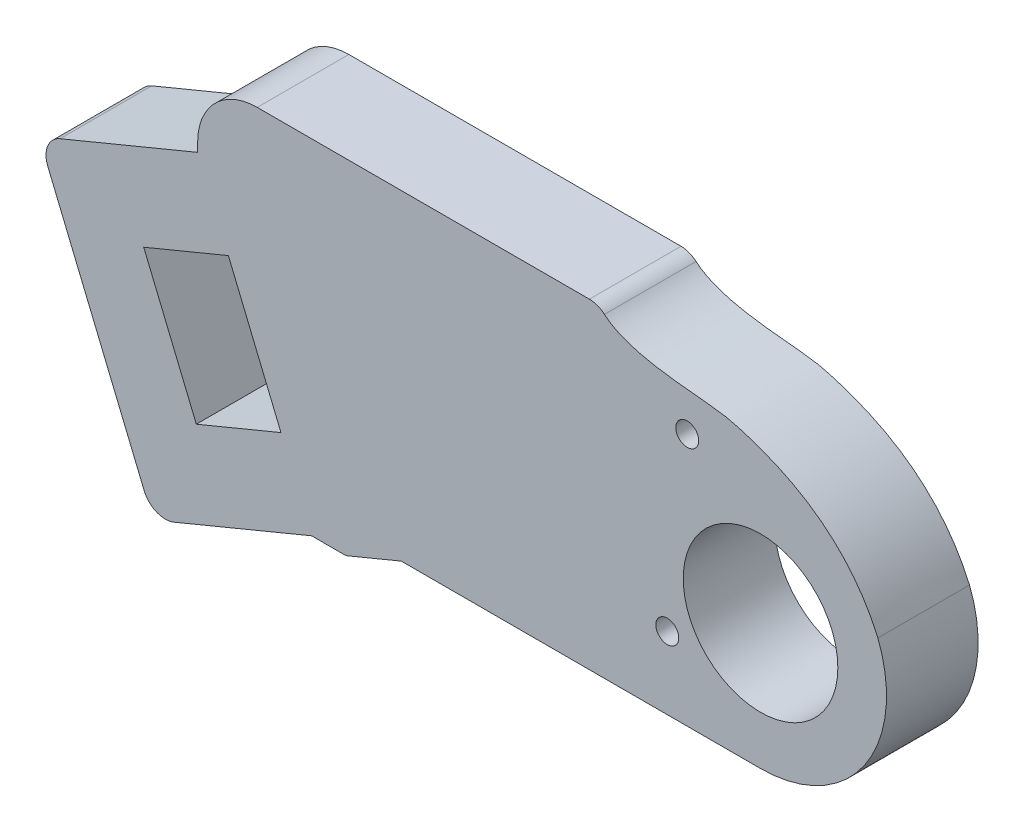
ISO-10303-21;
HEADER;
FILE_DESCRIPTION(('STEP AP214'),'2;1');
FILE_NAME('part.step','',(''),(''),'','','');
FILE_SCHEMA(('AUTOMOTIVE_DESIGN { 1 0 10303 214 1 1 1 1 }'));
ENDSEC;
DATA;
#1=APPLICATION_CONTEXT('core data for automotive mechanical design processes');
#2=APPLICATION_PROTOCOL_DEFINITION('international standard','automotive_design',2000,#1);
#3=PRODUCT_CONTEXT('',#1,'mechanical');
#4=PRODUCT('Part','Part','',(#3));
#5=PRODUCT_RELATED_PRODUCT_CATEGORY('part','',(#4));
#6=PRODUCT_DEFINITION_FORMATION('','',#4);
#7=PRODUCT_DEFINITION_CONTEXT('part definition',#1,'design');
#8=PRODUCT_DEFINITION('design','',#6,#7);
#9=PRODUCT_DEFINITION_SHAPE('','',#8);
#10=(LENGTH_UNIT() NAMED_UNIT(*) SI_UNIT(.MILLI.,.METRE.));
#11=(NAMED_UNIT(*) PLANE_ANGLE_UNIT() SI_UNIT($,.RADIAN.));
#12=(NAMED_UNIT(*) SI_UNIT($,.STERADIAN.) SOLID_ANGLE_UNIT());
#13=UNCERTAINTY_MEASURE_WITH_UNIT(LENGTH_MEASURE(1.E-05),#10,'distance_accuracy_value','');
#14=(GEOMETRIC_REPRESENTATION_CONTEXT(3) GLOBAL_UNCERTAINTY_ASSIGNED_CONTEXT((#13)) GLOBAL_UNIT_ASSIGNED_CONTEXT((#10,
#11,#12)) REPRESENTATION_CONTEXT('',''));
#15=CARTESIAN_POINT('',(0.,0.,0.));
#16=DIRECTION('',(0.,0.,1.));
#17=DIRECTION('',(1.,0.,0.));
#18=AXIS2_PLACEMENT_3D('',#15,#16,#17);
#19=CARTESIAN_POINT('',(-6.81325924700566,8.26376255504716,4.));
#20=CARTESIAN_POINT('',(-5.68486384244578,7.27869079757739,4.));
#21=CARTESIAN_POINT('',(-2.24199838869659,7.26152386591768,4.));
#22=CARTESIAN_POINT('',(0.0386305875536227,6.63882857446744,4.));
#23=CARTESIAN_POINT('',(3.65370221584129,5.3641451407928,4.));
#24=CARTESIAN_POINT('',(5.12347538297981,1.99999999999998,4.));
#25=B_SPLINE_CURVE_WITH_KNOTS('',3,(#19,#20,#21,#22,#23,#24),.UNSPECIFIED.,.F.,.F.,(4,1,1,4),
(0.028629024818179,0.402640229776119,0.499777327294301,1.),.UNSPECIFIED.);
#26=DIRECTION('',(0.,0.,-1.));
#27=VECTOR('',#26,1.);
#28=SURFACE_OF_LINEAR_EXTRUSION('',#25,#27);
#29=CARTESIAN_POINT('',(-6.81325924700566,8.26376255504716,0.));
#30=CARTESIAN_POINT('',(-5.68486384244578,7.27869079757739,0.));
#31=CARTESIAN_POINT('',(-2.24199838869659,7.26152386591768,0.));
#32=CARTESIAN_POINT('',(0.0386305875536227,6.63882857446744,0.));
#33=CARTESIAN_POINT('',(3.65370221584129,5.3641451407928,0.));
#34=CARTESIAN_POINT('',(5.12347538297981,1.99999999999998,0.));
#35=B_SPLINE_CURVE_WITH_KNOTS('',3,(#29,#30,#31,#32,#33,#34),.UNSPECIFIED.,.F.,.F.,(4,1,1,4),
(0.028629024818179,0.402640229776119,0.499777327294301,1.),.UNSPECIFIED.);
#36=CARTESIAN_POINT('',(-6.81325924700567,8.26376255504715,0.));
#37=VERTEX_POINT('',#36);
#38=CARTESIAN_POINT('',(5.1234753829798,1.99999999999998,0.));
#39=VERTEX_POINT('',#38);
#40=EDGE_CURVE('E212',#37,#39,#35,.T.);
#41=ORIENTED_EDGE('',*,*,#40,.F.);
#42=DIRECTION('',(0.,0.,-1.));
#43=VECTOR('',#42,1.);
#44=CARTESIAN_POINT('',(-6.81325924700567,8.26376255504715,4.));
#45=LINE('',#44,#43);
#46=CARTESIAN_POINT('',(-6.81325924700567,8.26376255504715,4.));
#47=VERTEX_POINT('',#46);
#48=EDGE_CURVE('E11',#47,#37,#45,.T.);
#49=ORIENTED_EDGE('',*,*,#48,.F.);
#50=CARTESIAN_POINT('',(5.1234753829798,1.99999999999998,4.));
#51=VERTEX_POINT('',#50);
#52=EDGE_CURVE('E307',#47,#51,#25,.T.);
#53=ORIENTED_EDGE('',*,*,#52,.T.);
#54=DIRECTION('',(0.,0.,-1.));
#55=VECTOR('',#54,1.);
#56=CARTESIAN_POINT('',(5.1234753829798,1.99999999999998,4.));
#57=LINE('',#56,#55);
#58=EDGE_CURVE('E119',#51,#39,#57,.T.);
#59=ORIENTED_EDGE('',*,*,#58,.T.);
#60=EDGE_LOOP('',(#41,#49,#53,#59));
#61=FACE_BOUND('',#60,.T.);
#62=ADVANCED_FACE('F36',(#61),#28,.T.);
#63=CARTESIAN_POINT('',(-7.47090350616536,7.51043392264672,4.));
#64=DIRECTION('',(0.,0.,-1.));
#65=DIRECTION('',(-1.,0.,0.));
#66=AXIS2_PLACEMENT_3D('',#63,#64,#65);
#67=CYLINDRICAL_SURFACE('',#66,1.);
#68=CARTESIAN_POINT('',(-7.47090350616536,7.51043392264672,0.));
#69=DIRECTION('',(0.,0.,1.));
#70=DIRECTION('',(1.,0.,0.));
#71=AXIS2_PLACEMENT_3D('',#68,#69,#70);
#72=CIRCLE('',#71,1.);
#73=CARTESIAN_POINT('',(-7.47090350616536,8.51043392264672,0.));
#74=VERTEX_POINT('',#73);
#75=EDGE_CURVE('E217',#74,#37,#72,.F.);
#76=ORIENTED_EDGE('',*,*,#75,.F.);
#77=DIRECTION('',(0.,0.,-1.));
#78=VECTOR('',#77,1.);
#79=CARTESIAN_POINT('',(-7.47090350616536,8.51043392264672,4.));
#80=LINE('',#79,#78);
#81=CARTESIAN_POINT('',(-7.47090350616536,8.51043392264672,4.));
#82=VERTEX_POINT('',#81);
#83=EDGE_CURVE('E46',#82,#74,#80,.T.);
#84=ORIENTED_EDGE('',*,*,#83,.F.);
#85=CARTESIAN_POINT('',(-7.47090350616536,7.51043392264672,4.));
#86=DIRECTION('',(0.,0.,1.));
#87=DIRECTION('',(1.,0.,0.));
#88=AXIS2_PLACEMENT_3D('',#85,#86,#87);
#89=CIRCLE('',#88,1.);
#90=EDGE_CURVE('E316',#82,#47,#89,.F.);
#91=ORIENTED_EDGE('',*,*,#90,.T.);
#92=ORIENTED_EDGE('',*,*,#48,.T.);
#93=EDGE_LOOP('',(#76,#84,#91,#92));
#94=FACE_BOUND('',#93,.T.);
#95=ADVANCED_FACE('F325',(#94),#67,.T.);
#96=CARTESIAN_POINT('',(0.,8.51043392264672,4.));
#97=DIRECTION('',(0.,1.,0.));
#98=DIRECTION('',(0.,0.,1.));
#99=AXIS2_PLACEMENT_3D('',#96,#97,#98);
#100=PLANE('',#99);
#101=DIRECTION('',(1.,0.,0.));
#102=VECTOR('',#101,1.);
#103=CARTESIAN_POINT('',(0.,8.51043392264672,0.));
#104=LINE('',#103,#102);
#105=CARTESIAN_POINT('',(-21.9709035061654,8.51043392264672,0.));
#106=VERTEX_POINT('',#105);
#107=EDGE_CURVE('E223',#106,#74,#104,.T.);
#108=ORIENTED_EDGE('',*,*,#107,.F.);
#109=DIRECTION('',(0.,0.,-1.));
#110=VECTOR('',#109,1.);
#111=CARTESIAN_POINT('',(-21.9709035061654,8.51043392264672,4.));
#112=LINE('',#111,#110);
#113=CARTESIAN_POINT('',(-21.9709035061654,8.51043392264672,4.));
#114=VERTEX_POINT('',#113);
#115=EDGE_CURVE('E276',#114,#106,#112,.T.);
#116=ORIENTED_EDGE('',*,*,#115,.F.);
#117=DIRECTION('',(1.,0.,0.));
#118=VECTOR('',#117,1.);
#119=CARTESIAN_POINT('',(0.,8.51043392264672,4.));
#120=LINE('',#119,#118);
#121=EDGE_CURVE('E398',#114,#82,#120,.T.);
#122=ORIENTED_EDGE('',*,*,#121,.T.);
#123=ORIENTED_EDGE('',*,*,#83,.T.);
#124=EDGE_LOOP('',(#108,#116,#122,#123));
#125=FACE_BOUND('',#124,.T.);
#126=ADVANCED_FACE('F377',(#125),#100,.T.);
#127=CARTESIAN_POINT('',(-21.9709035061654,5.91043392264672,4.));
#128=DIRECTION('',(0.,0.,-1.));
#129=DIRECTION('',(-1.,0.,0.));
#130=AXIS2_PLACEMENT_3D('',#127,#128,#129);
#131=CYLINDRICAL_SURFACE('',#130,2.6);
#132=CARTESIAN_POINT('',(-21.9709035061654,5.91043392264672,0.));
#133=DIRECTION('',(0.,0.,1.));
#134=DIRECTION('',(1.,0.,0.));
#135=AXIS2_PLACEMENT_3D('',#132,#133,#134);
#136=CIRCLE('',#135,2.6);
#137=CARTESIAN_POINT('',(-24.5709035061654,5.91043392264672,0.));
#138=VERTEX_POINT('',#137);
#139=EDGE_CURVE('E226',#106,#138,#136,.T.);
#140=ORIENTED_EDGE('',*,*,#139,.T.);
#141=DIRECTION('',(0.,0.,-1.));
#142=VECTOR('',#141,1.);
#143=CARTESIAN_POINT('',(-24.5709035061654,5.91043392264672,4.));
#144=LINE('',#143,#142);
#145=CARTESIAN_POINT('',(-24.5709035061654,5.91043392264672,4.));
#146=VERTEX_POINT('',#145);
#147=EDGE_CURVE('E274',#146,#138,#144,.T.);
#148=ORIENTED_EDGE('',*,*,#147,.F.);
#149=CARTESIAN_POINT('',(-21.9709035061654,5.91043392264672,4.));
#150=DIRECTION('',(0.,0.,1.));
#151=DIRECTION('',(1.,0.,0.));
#152=AXIS2_PLACEMENT_3D('',#149,#150,#151);
#153=CIRCLE('',#152,2.6);
#154=EDGE_CURVE('E394',#114,#146,#153,.T.);
#155=ORIENTED_EDGE('',*,*,#154,.F.);
#156=ORIENTED_EDGE('',*,*,#115,.T.);
#157=EDGE_LOOP('',(#140,#148,#155,#156));
#158=FACE_BOUND('',#157,.T.);
#159=ADVANCED_FACE('F374',(#158),#131,.T.);
#160=CARTESIAN_POINT('',(-24.5709035061653,-2.13118615690529E-13,4.));
#161=DIRECTION('',(-1.,0.,0.));
#162=DIRECTION('',(0.,-1.,0.));
#163=AXIS2_PLACEMENT_3D('',#160,#161,#162);
#164=PLANE('',#163);
#165=DIRECTION('',(0.,1.,0.));
#166=VECTOR('',#165,1.);
#167=CARTESIAN_POINT('',(-24.5709035061653,-2.13118615690529E-13,0.));
#168=LINE('',#167,#166);
#169=CARTESIAN_POINT('',(-24.5709035061654,5.51043392264672,0.));
#170=VERTEX_POINT('',#169);
#171=EDGE_CURVE('E229',#170,#138,#168,.T.);
#172=ORIENTED_EDGE('',*,*,#171,.F.);
#173=DIRECTION('',(0.,0.,-1.));
#174=VECTOR('',#173,1.);
#175=CARTESIAN_POINT('',(-24.5709035061654,5.51043392264672,4.));
#176=LINE('',#175,#174);
#177=CARTESIAN_POINT('',(-24.5709035061654,5.51043392264672,4.));
#178=VERTEX_POINT('',#177);
#179=EDGE_CURVE('E272',#178,#170,#176,.T.);
#180=ORIENTED_EDGE('',*,*,#179,.F.);
#181=DIRECTION('',(0.,1.,0.));
#182=VECTOR('',#181,1.);
#183=CARTESIAN_POINT('',(-24.5709035061653,-2.13118615690529E-13,4.));
#184=LINE('',#183,#182);
#185=EDGE_CURVE('E397',#178,#146,#184,.T.);
#186=ORIENTED_EDGE('',*,*,#185,.T.);
#187=ORIENTED_EDGE('',*,*,#147,.T.);
#188=EDGE_LOOP('',(#172,#180,#186,#187));
#189=FACE_BOUND('',#188,.T.);
#190=ADVANCED_FACE('F370',(#189),#164,.T.);
#191=CARTESIAN_POINT('',(-5.54655810552972,13.3905758028602,4.));
#192=DIRECTION('',(-0.382683432365091,0.923879532511286,0.));
#193=DIRECTION('',(-0.923879532511286,-0.382683432365091,0.));
#194=AXIS2_PLACEMENT_3D('',#191,#192,#193);
#195=PLANE('',#194);
#196=DIRECTION('',(0.923879532511286,0.382683432365091,0.));
#197=VECTOR('',#196,1.);
#198=CARTESIAN_POINT('',(-5.54655810552972,13.3905758028602,0.));
#199=LINE('',#198,#197);
#200=CARTESIAN_POINT('',(-30.5761204674887,3.02299161227364,0.));
#201=VERTEX_POINT('',#200);
#202=EDGE_CURVE('E232',#201,#170,#199,.T.);
#203=ORIENTED_EDGE('',*,*,#202,.F.);
#204=DIRECTION('',(0.,0.,-1.));
#205=VECTOR('',#204,1.);
#206=CARTESIAN_POINT('',(-30.5761204674887,3.02299161227364,4.));
#207=LINE('',#206,#205);
#208=CARTESIAN_POINT('',(-30.5761204674887,3.02299161227364,4.));
#209=VERTEX_POINT('',#208);
#210=EDGE_CURVE('E270',#209,#201,#207,.T.);
#211=ORIENTED_EDGE('',*,*,#210,.F.);
#212=DIRECTION('',(0.923879532511286,0.382683432365091,0.));
#213=VECTOR('',#212,1.);
#214=CARTESIAN_POINT('',(-5.54655810552972,13.3905758028602,4.));
#215=LINE('',#214,#213);
#216=EDGE_CURVE('E404',#209,#178,#215,.T.);
#217=ORIENTED_EDGE('',*,*,#216,.T.);
#218=ORIENTED_EDGE('',*,*,#179,.T.);
#219=EDGE_LOOP('',(#203,#211,#217,#218));
#220=FACE_BOUND('',#219,.T.);
#221=ADVANCED_FACE('F366',(#220),#195,.T.);
#222=CARTESIAN_POINT('',(-30.1934370351236,2.09911207976235,4.));
#223=DIRECTION('',(0.,0.,-1.));
#224=DIRECTION('',(-1.,0.,0.));
#225=AXIS2_PLACEMENT_3D('',#222,#223,#224);
#226=CYLINDRICAL_SURFACE('',#225,1.);
#227=CARTESIAN_POINT('',(-30.1934370351236,2.09911207976235,0.));
#228=DIRECTION('',(0.,0.,1.));
#229=DIRECTION('',(1.,0.,0.));
#230=AXIS2_PLACEMENT_3D('',#227,#228,#229);
#231=CIRCLE('',#230,1.);
#232=CARTESIAN_POINT('',(-31.1173165676349,1.71642864739726,0.));
#233=VERTEX_POINT('',#232);
#234=EDGE_CURVE('E235',#201,#233,#231,.T.);
#235=ORIENTED_EDGE('',*,*,#234,.T.);
#236=DIRECTION('',(0.,0.,-1.));
#237=VECTOR('',#236,1.);
#238=CARTESIAN_POINT('',(-31.1173165676349,1.71642864739726,4.));
#239=LINE('',#238,#237);
#240=CARTESIAN_POINT('',(-31.1173165676349,1.71642864739726,4.));
#241=VERTEX_POINT('',#240);
#242=EDGE_CURVE('E268',#241,#233,#239,.T.);
#243=ORIENTED_EDGE('',*,*,#242,.F.);
#244=CARTESIAN_POINT('',(-30.1934370351236,2.09911207976235,4.));
#245=DIRECTION('',(0.,0.,1.));
#246=DIRECTION('',(1.,0.,0.));
#247=AXIS2_PLACEMENT_3D('',#244,#245,#246);
#248=CIRCLE('',#247,1.);
#249=EDGE_CURVE('E407',#209,#241,#248,.T.);
#250=ORIENTED_EDGE('',*,*,#249,.F.);
#251=ORIENTED_EDGE('',*,*,#210,.T.);
#252=EDGE_LOOP('',(#235,#243,#250,#251));
#253=FACE_BOUND('',#252,.T.);
#254=ADVANCED_FACE('F362',(#253),#226,.T.);
#255=CARTESIAN_POINT('',(-25.9534418944703,-10.7502676229517,4.));
#256=DIRECTION('',(-0.923879532511287,-0.382683432365091,0.));
#257=DIRECTION('',(0.382683432365091,-0.923879532511287,0.));
#258=AXIS2_PLACEMENT_3D('',#255,#256,#257);
#259=PLANE('',#258);
#260=DIRECTION('',(-0.382683432365091,0.923879532511287,0.));
#261=VECTOR('',#260,1.);
#262=CARTESIAN_POINT('',(-25.9534418944703,-10.7502676229517,0.));
#263=LINE('',#262,#261);
#264=CARTESIAN_POINT('',(-26.9077988116189,-8.4462462102269,0.));
#265=VERTEX_POINT('',#264);
#266=EDGE_CURVE('E238',#265,#233,#263,.T.);
#267=ORIENTED_EDGE('',*,*,#266,.F.);
#268=DIRECTION('',(0.,0.,-1.));
#269=VECTOR('',#268,1.);
#270=CARTESIAN_POINT('',(-26.9077988116189,-8.4462462102269,4.));
#271=LINE('',#270,#269);
#272=CARTESIAN_POINT('',(-26.9077988116189,-8.4462462102269,4.));
#273=VERTEX_POINT('',#272);
#274=EDGE_CURVE('E266',#273,#265,#271,.T.);
#275=ORIENTED_EDGE('',*,*,#274,.F.);
#276=DIRECTION('',(-0.382683432365091,0.923879532511287,0.));
#277=VECTOR('',#276,1.);
#278=CARTESIAN_POINT('',(-25.9534418944703,-10.7502676229517,4.));
#279=LINE('',#278,#277);
#280=EDGE_CURVE('E409',#273,#241,#279,.T.);
#281=ORIENTED_EDGE('',*,*,#280,.T.);
#282=ORIENTED_EDGE('',*,*,#242,.T.);
#283=EDGE_LOOP('',(#267,#275,#281,#282));
#284=FACE_BOUND('',#283,.T.);
#285=ADVANCED_FACE('F358',(#284),#259,.T.);
#286=CARTESIAN_POINT('',(-25.9839192791076,-8.0635627778618,4.));
#287=DIRECTION('',(0.,0.,-1.));
#288=DIRECTION('',(-1.,0.,0.));
#289=AXIS2_PLACEMENT_3D('',#286,#287,#288);
#290=CYLINDRICAL_SURFACE('',#289,0.999999999999999);
#291=CARTESIAN_POINT('',(-25.9839192791076,-8.0635627778618,0.));
#292=DIRECTION('',(0.,0.,1.));
#293=DIRECTION('',(1.,0.,0.));
#294=AXIS2_PLACEMENT_3D('',#291,#292,#293);
#295=CIRCLE('',#294,0.999999999999999);
#296=CARTESIAN_POINT('',(-25.6012358467425,-8.98744231037309,0.));
#297=VERTEX_POINT('',#296);
#298=EDGE_CURVE('E241',#297,#265,#295,.F.);
#299=ORIENTED_EDGE('',*,*,#298,.F.);
#300=DIRECTION('',(0.,0.,-1.));
#301=VECTOR('',#300,1.);
#302=CARTESIAN_POINT('',(-25.6012358467425,-8.98744231037309,4.));
#303=LINE('',#302,#301);
#304=CARTESIAN_POINT('',(-25.6012358467425,-8.98744231037309,4.));
#305=VERTEX_POINT('',#304);
#306=EDGE_CURVE('E264',#305,#297,#303,.T.);
#307=ORIENTED_EDGE('',*,*,#306,.F.);
#308=CARTESIAN_POINT('',(-25.9839192791076,-8.0635627778618,4.));
#309=DIRECTION('',(0.,0.,1.));
#310=DIRECTION('',(1.,0.,0.));
#311=AXIS2_PLACEMENT_3D('',#308,#309,#310);
#312=CIRCLE('',#311,0.999999999999999);
#313=EDGE_CURVE('E412',#305,#273,#312,.F.);
#314=ORIENTED_EDGE('',*,*,#313,.T.);
#315=ORIENTED_EDGE('',*,*,#274,.T.);
#316=EDGE_LOOP('',(#299,#307,#314,#315));
#317=FACE_BOUND('',#316,.T.);
#318=ADVANCED_FACE('F354',(#317),#290,.T.);
#319=CARTESIAN_POINT('',(-0.571673484783539,1.38014188021351,4.));
#320=DIRECTION('',(0.38268343236509,-0.923879532511287,0.));
#321=DIRECTION('',(0.923879532511287,0.38268343236509,0.));
#322=AXIS2_PLACEMENT_3D('',#319,#320,#321);
#323=PLANE('',#322);
#324=DIRECTION('',(-0.923879532511287,-0.38268343236509,0.));
#325=VECTOR('',#324,1.);
#326=CARTESIAN_POINT('',(-0.571673484783539,1.38014188021351,0.));
#327=LINE('',#326,#325);
#328=CARTESIAN_POINT('',(-19.5960188854192,-6.50000000000001,0.));
#329=VERTEX_POINT('',#328);
#330=EDGE_CURVE('E244',#329,#297,#327,.T.);
#331=ORIENTED_EDGE('',*,*,#330,.F.);
#332=DIRECTION('',(0.,0.,-1.));
#333=VECTOR('',#332,1.);
#334=CARTESIAN_POINT('',(-19.5960188854192,-6.50000000000001,4.));
#335=LINE('',#334,#333);
#336=CARTESIAN_POINT('',(-19.5960188854192,-6.50000000000001,4.));
#337=VERTEX_POINT('',#336);
#338=EDGE_CURVE('E262',#337,#329,#335,.T.);
#339=ORIENTED_EDGE('',*,*,#338,.F.);
#340=DIRECTION('',(-0.923879532511287,-0.38268343236509,0.));
#341=VECTOR('',#340,1.);
#342=CARTESIAN_POINT('',(-0.571673484783539,1.38014188021351,4.));
#343=LINE('',#342,#341);
#344=EDGE_CURVE('E415',#337,#305,#343,.T.);
#345=ORIENTED_EDGE('',*,*,#344,.T.);
#346=ORIENTED_EDGE('',*,*,#306,.T.);
#347=EDGE_LOOP('',(#331,#339,#345,#346));
#348=FACE_BOUND('',#347,.T.);
#349=ADVANCED_FACE('F350',(#348),#323,.T.);
#350=CARTESIAN_POINT('',(0.,-6.50000000000002,4.));
#351=DIRECTION('',(0.,-1.,0.));
#352=DIRECTION('',(1.,0.,0.));
#353=AXIS2_PLACEMENT_3D('',#350,#351,#352);
#354=PLANE('',#353);
#355=DIRECTION('',(-1.,0.,0.));
#356=VECTOR('',#355,1.);
#357=CARTESIAN_POINT('',(0.,-6.50000000000002,0.));
#358=LINE('',#357,#356);
#359=CARTESIAN_POINT('',(-18.0960188854192,-6.50000000000001,0.));
#360=VERTEX_POINT('',#359);
#361=EDGE_CURVE('E247',#360,#329,#358,.T.);
#362=ORIENTED_EDGE('',*,*,#361,.F.);
#363=DIRECTION('',(0.,0.,-1.));
#364=VECTOR('',#363,1.);
#365=CARTESIAN_POINT('',(-18.0960188854192,-6.50000000000001,4.));
#366=LINE('',#365,#364);
#367=CARTESIAN_POINT('',(-18.0960188854192,-6.50000000000001,4.));
#368=VERTEX_POINT('',#367);
#369=EDGE_CURVE('E182',#368,#360,#366,.T.);
#370=ORIENTED_EDGE('',*,*,#369,.F.);
#371=DIRECTION('',(-1.,0.,0.));
#372=VECTOR('',#371,1.);
#373=CARTESIAN_POINT('',(0.,-6.50000000000002,4.));
#374=LINE('',#373,#372);
#375=EDGE_CURVE('E190',#368,#337,#374,.T.);
#376=ORIENTED_EDGE('',*,*,#375,.T.);
#377=ORIENTED_EDGE('',*,*,#338,.T.);
#378=EDGE_LOOP('',(#362,#370,#376,#377));
#379=FACE_BOUND('',#378,.T.);
#380=ADVANCED_FACE('F343',(#379),#354,.T.);
#381=CARTESIAN_POINT('',(-0.35200357067345,0.849811794323596,4.));
#382=DIRECTION('',(0.382683432365091,-0.923879532511287,0.));
#383=DIRECTION('',(0.923879532511287,0.382683432365091,0.));
#384=AXIS2_PLACEMENT_3D('',#381,#382,#383);
#385=PLANE('',#384);
#386=DIRECTION('',(-0.923879532511287,-0.382683432365091,0.));
#387=VECTOR('',#386,1.);
#388=CARTESIAN_POINT('',(-0.35200357067345,0.849811794323596,0.));
#389=LINE('',#388,#387);
#390=CARTESIAN_POINT('',(-15.6818053230461,-5.5,0.));
#391=VERTEX_POINT('',#390);
#392=EDGE_CURVE('E177',#391,#360,#389,.T.);
#393=ORIENTED_EDGE('',*,*,#392,.F.);
#394=DIRECTION('',(0.,0.,-1.));
#395=VECTOR('',#394,1.);
#396=CARTESIAN_POINT('',(-15.6818053230461,-5.5,4.));
#397=LINE('',#396,#395);
#398=CARTESIAN_POINT('',(-15.6818053230461,-5.5,4.));
#399=VERTEX_POINT('',#398);
#400=EDGE_CURVE('E172',#399,#391,#397,.T.);
#401=ORIENTED_EDGE('',*,*,#400,.F.);
#402=DIRECTION('',(-0.923879532511287,-0.382683432365091,0.));
#403=VECTOR('',#402,1.);
#404=CARTESIAN_POINT('',(-0.35200357067345,0.849811794323596,4.));
#405=LINE('',#404,#403);
#406=EDGE_CURVE('E175',#399,#368,#405,.T.);
#407=ORIENTED_EDGE('',*,*,#406,.T.);
#408=ORIENTED_EDGE('',*,*,#369,.T.);
#409=EDGE_LOOP('',(#393,#401,#407,#408));
#410=FACE_BOUND('',#409,.T.);
#411=ADVANCED_FACE('F174',(#410),#385,.T.);
#412=CARTESIAN_POINT('',(0.,-5.5,4.));
#413=DIRECTION('',(0.,-1.,0.));
#414=DIRECTION('',(1.,0.,0.));
#415=AXIS2_PLACEMENT_3D('',#412,#413,#414);
#416=PLANE('',#415);
#417=DIRECTION('',(-1.,0.,0.));
#418=VECTOR('',#417,1.);
#419=CARTESIAN_POINT('',(0.,-5.5,0.));
#420=LINE('',#419,#418);
#421=CARTESIAN_POINT('',(0.,-5.5,0.));
#422=VERTEX_POINT('',#421);
#423=EDGE_CURVE('E251',#422,#391,#420,.T.);
#424=ORIENTED_EDGE('',*,*,#423,.F.);
#425=DIRECTION('',(0.,0.,-1.));
#426=VECTOR('',#425,1.);
#427=CARTESIAN_POINT('',(0.,-5.5,4.));
#428=LINE('',#427,#426);
#429=CARTESIAN_POINT('',(0.,-5.5,4.));
#430=VERTEX_POINT('',#429);
#431=EDGE_CURVE('E112',#430,#422,#428,.T.);
#432=ORIENTED_EDGE('',*,*,#431,.F.);
#433=DIRECTION('',(-1.,0.,0.));
#434=VECTOR('',#433,1.);
#435=CARTESIAN_POINT('',(0.,-5.5,4.));
#436=LINE('',#435,#434);
#437=EDGE_CURVE('E187',#430,#399,#436,.T.);
#438=ORIENTED_EDGE('',*,*,#437,.T.);
#439=ORIENTED_EDGE('',*,*,#400,.T.);
#440=EDGE_LOOP('',(#424,#432,#438,#439));
#441=FACE_BOUND('',#440,.T.);
#442=ADVANCED_FACE('F192',(#441),#416,.T.);
#443=CARTESIAN_POINT('',(-19.0243454006356,-7.88014188021351,4.));
#444=DIRECTION('',(-0.923879532511287,-0.38268343236509,0.));
#445=DIRECTION('',(0.38268343236509,-0.923879532511287,0.));
#446=AXIS2_PLACEMENT_3D('',#443,#444,#445);
#447=PLANE('',#446);
#448=DIRECTION('',(-0.38268343236509,0.923879532511287,0.));
#449=VECTOR('',#448,1.);
#450=CARTESIAN_POINT('',(-19.0243454006356,-7.88014188021351,0.));
#451=LINE('',#450,#449);
#452=CARTESIAN_POINT('',(-20.935410898697,-3.2664216362105,0.));
#453=VERTEX_POINT('',#452);
#454=CARTESIAN_POINT('',(-23.2315114928875,2.27685555885722,0.));
#455=VERTEX_POINT('',#454);
#456=EDGE_CURVE('E201',#453,#455,#451,.T.);
#457=ORIENTED_EDGE('',*,*,#456,.F.);
#458=DIRECTION('',(0.,0.,-1.));
#459=VECTOR('',#458,1.);
#460=CARTESIAN_POINT('',(-20.935410898697,-3.2664216362105,4.));
#461=LINE('',#460,#459);
#462=CARTESIAN_POINT('',(-20.935410898697,-3.2664216362105,4.));
#463=VERTEX_POINT('',#462);
#464=EDGE_CURVE('E40',#463,#453,#461,.T.);
#465=ORIENTED_EDGE('',*,*,#464,.F.);
#466=DIRECTION('',(-0.38268343236509,0.923879532511287,0.));
#467=VECTOR('',#466,1.);
#468=CARTESIAN_POINT('',(-19.0243454006356,-7.88014188021351,4.));
#469=LINE('',#468,#467);
#470=CARTESIAN_POINT('',(-23.2315114928875,2.27685555885722,4.));
#471=VERTEX_POINT('',#470);
#472=EDGE_CURVE('E258',#463,#471,#469,.T.);
#473=ORIENTED_EDGE('',*,*,#472,.T.);
#474=DIRECTION('',(0.,0.,-1.));
#475=VECTOR('',#474,1.);
#476=CARTESIAN_POINT('',(-23.2315114928875,2.27685555885722,4.));
#477=LINE('',#476,#475);
#478=EDGE_CURVE('E200',#471,#455,#477,.T.);
#479=ORIENTED_EDGE('',*,*,#478,.T.);
#480=EDGE_LOOP('',(#457,#465,#473,#479));
#481=FACE_BOUND('',#480,.T.);
#482=ADVANCED_FACE('F38',(#481),#447,.T.);
#483=CARTESIAN_POINT('',(-1.91106549806136,4.61372024400301,4.));
#484=DIRECTION('',(0.382683432365091,-0.923879532511286,0.));
#485=DIRECTION('',(0.923879532511286,0.382683432365091,0.));
#486=AXIS2_PLACEMENT_3D('',#483,#484,#485);
#487=PLANE('',#486);
#488=DIRECTION('',(-0.923879532511286,-0.382683432365091,0.));
#489=VECTOR('',#488,1.);
#490=CARTESIAN_POINT('',(-1.91106549806136,4.61372024400301,0.));
#491=LINE('',#490,#489);
#492=CARTESIAN_POINT('',(-24.6309290287421,-4.79715536567086,0.));
#493=VERTEX_POINT('',#492);
#494=EDGE_CURVE('E204',#453,#493,#491,.T.);
#495=ORIENTED_EDGE('',*,*,#494,.T.);
#496=DIRECTION('',(0.,0.,-1.));
#497=VECTOR('',#496,1.);
#498=CARTESIAN_POINT('',(-24.6309290287421,-4.79715536567086,4.));
#499=LINE('',#498,#497);
#500=CARTESIAN_POINT('',(-24.6309290287421,-4.79715536567086,4.));
#501=VERTEX_POINT('',#500);
#502=EDGE_CURVE('E282',#501,#493,#499,.T.);
#503=ORIENTED_EDGE('',*,*,#502,.F.);
#504=DIRECTION('',(-0.923879532511286,-0.382683432365091,0.));
#505=VECTOR('',#504,1.);
#506=CARTESIAN_POINT('',(-1.91106549806136,4.61372024400301,4.));
#507=LINE('',#506,#505);
#508=EDGE_CURVE('E291',#463,#501,#507,.T.);
#509=ORIENTED_EDGE('',*,*,#508,.F.);
#510=ORIENTED_EDGE('',*,*,#464,.T.);
#511=EDGE_LOOP('',(#495,#503,#509,#510));
#512=FACE_BOUND('',#511,.T.);
#513=ADVANCED_FACE('F290',(#512),#487,.F.);
#514=CARTESIAN_POINT('',(-22.7198635306808,-9.41087560967388,4.));
#515=DIRECTION('',(-0.923879532511286,-0.382683432365091,0.));
#516=DIRECTION('',(0.382683432365091,-0.923879532511286,0.));
#517=AXIS2_PLACEMENT_3D('',#514,#515,#516);
#518=PLANE('',#517);
#519=DIRECTION('',(-0.382683432365091,0.923879532511286,0.));
#520=VECTOR('',#519,1.);
#521=CARTESIAN_POINT('',(-22.7198635306808,-9.41087560967388,0.));
#522=LINE('',#521,#520);
#523=CARTESIAN_POINT('',(-26.9270296229327,0.746121829396856,0.));
#524=VERTEX_POINT('',#523);
#525=EDGE_CURVE('E207',#493,#524,#522,.T.);
#526=ORIENTED_EDGE('',*,*,#525,.T.);
#527=DIRECTION('',(0.,0.,-1.));
#528=VECTOR('',#527,1.);
#529=CARTESIAN_POINT('',(-26.9270296229327,0.746121829396856,4.));
#530=LINE('',#529,#528);
#531=CARTESIAN_POINT('',(-26.9270296229327,0.746121829396856,4.));
#532=VERTEX_POINT('',#531);
#533=EDGE_CURVE('E280',#532,#524,#530,.T.);
#534=ORIENTED_EDGE('',*,*,#533,.F.);
#535=DIRECTION('',(-0.382683432365091,0.923879532511286,0.));
#536=VECTOR('',#535,1.);
#537=CARTESIAN_POINT('',(-22.7198635306808,-9.41087560967388,4.));
#538=LINE('',#537,#536);
#539=EDGE_CURVE('E304',#501,#532,#538,.T.);
#540=ORIENTED_EDGE('',*,*,#539,.F.);
#541=ORIENTED_EDGE('',*,*,#502,.T.);
#542=EDGE_LOOP('',(#526,#534,#540,#541));
#543=FACE_BOUND('',#542,.T.);
#544=ADVANCED_FACE('F303',(#543),#518,.F.);
#545=CARTESIAN_POINT('',(0.,0.,4.));
#546=DIRECTION('',(0.,0.,-1.));
#547=DIRECTION('',(-1.,0.,0.));
#548=AXIS2_PLACEMENT_3D('',#545,#546,#547);
#549=CYLINDRICAL_SURFACE('',#548,5.5);
#550=CARTESIAN_POINT('',(0.,0.,0.));
#551=DIRECTION('',(0.,0.,1.));
#552=DIRECTION('',(1.,0.,0.));
#553=AXIS2_PLACEMENT_3D('',#550,#551,#552);
#554=CIRCLE('',#553,5.5);
#555=EDGE_CURVE('E253',#422,#39,#554,.T.);
#556=ORIENTED_EDGE('',*,*,#555,.T.);
#557=ORIENTED_EDGE('',*,*,#58,.F.);
#558=CARTESIAN_POINT('',(0.,0.,4.));
#559=DIRECTION('',(0.,0.,1.));
#560=DIRECTION('',(1.,0.,0.));
#561=AXIS2_PLACEMENT_3D('',#558,#559,#560);
#562=CIRCLE('',#561,5.5);
#563=EDGE_CURVE('E55',#430,#51,#562,.T.);
#564=ORIENTED_EDGE('',*,*,#563,.F.);
#565=ORIENTED_EDGE('',*,*,#431,.T.);
#566=EDGE_LOOP('',(#556,#557,#564,#565));
#567=FACE_BOUND('',#566,.T.);
#568=ADVANCED_FACE('F330',(#567),#549,.T.);
#569=CARTESIAN_POINT('',(-4.20716609225189,10.1569974390707,4.));
#570=DIRECTION('',(-0.38268343236509,0.923879532511287,0.));
#571=DIRECTION('',(-0.923879532511287,-0.38268343236509,0.));
#572=AXIS2_PLACEMENT_3D('',#569,#570,#571);
#573=PLANE('',#572);
#574=DIRECTION('',(0.923879532511287,0.38268343236509,0.));
#575=VECTOR('',#574,1.);
#576=CARTESIAN_POINT('',(-4.20716609225189,10.1569974390707,0.));
#577=LINE('',#576,#575);
#578=EDGE_CURVE('E209',#524,#455,#577,.T.);
#579=ORIENTED_EDGE('',*,*,#578,.T.);
#580=ORIENTED_EDGE('',*,*,#478,.F.);
#581=DIRECTION('',(0.923879532511287,0.38268343236509,0.));
#582=VECTOR('',#581,1.);
#583=CARTESIAN_POINT('',(-4.20716609225189,10.1569974390707,4.));
#584=LINE('',#583,#582);
#585=EDGE_CURVE('E302',#532,#471,#584,.T.);
#586=ORIENTED_EDGE('',*,*,#585,.F.);
#587=ORIENTED_EDGE('',*,*,#533,.T.);
#588=EDGE_LOOP('',(#579,#580,#586,#587));
#589=FACE_BOUND('',#588,.T.);
#590=ADVANCED_FACE('F300',(#589),#573,.F.);
#591=CARTESIAN_POINT('',(0.,0.,4.));
#592=DIRECTION('',(0.,0.,-1.));
#593=DIRECTION('',(-1.,0.,0.));
#594=AXIS2_PLACEMENT_3D('',#591,#592,#593);
#595=CYLINDRICAL_SURFACE('',#594,3.375);
#596=CARTESIAN_POINT('',(0.,0.,4.));
#597=DIRECTION('',(0.,0.,1.));
#598=DIRECTION('',(1.,0.,0.));
#599=AXIS2_PLACEMENT_3D('',#596,#597,#598);
#600=CIRCLE('',#599,3.375);
#601=CARTESIAN_POINT('',(3.375,0.,4.));
#602=VERTEX_POINT('',#601);
#603=EDGE_CURVE('E194',#602,#602,#600,.T.);
#604=ORIENTED_EDGE('',*,*,#603,.T.);
#605=EDGE_LOOP('',(#604));
#606=FACE_BOUND('',#605,.T.);
#607=CARTESIAN_POINT('',(0.,0.,0.));
#608=DIRECTION('',(0.,0.,1.));
#609=DIRECTION('',(1.,0.,0.));
#610=AXIS2_PLACEMENT_3D('',#607,#608,#609);
#611=CIRCLE('',#610,3.375);
#612=CARTESIAN_POINT('',(3.375,0.,0.));
#613=VERTEX_POINT('',#612);
#614=EDGE_CURVE('E255',#613,#613,#611,.T.);
#615=ORIENTED_EDGE('',*,*,#614,.F.);
#616=EDGE_LOOP('',(#615));
#617=FACE_BOUND('',#616,.T.);
#618=ADVANCED_FACE('F329',(#606,#617),#595,.F.);
#619=CARTESIAN_POINT('',(0.,0.,4.));
#620=DIRECTION('',(0.,0.,1.));
#621=DIRECTION('',(1.,0.,0.));
#622=AXIS2_PLACEMENT_3D('',#619,#620,#621);
#623=PLANE('',#622);
#624=CARTESIAN_POINT('',(-3.2,5.54256258422041,4.));
#625=DIRECTION('',(0.,0.,1.));
#626=DIRECTION('',(1.,0.,0.));
#627=AXIS2_PLACEMENT_3D('',#624,#625,#626);
#628=CIRCLE('',#627,0.5);
#629=CARTESIAN_POINT('',(-2.7,5.54256258422041,4.));
#630=VERTEX_POINT('',#629);
#631=EDGE_CURVE('E586',#630,#630,#628,.T.);
#632=ORIENTED_EDGE('',*,*,#631,.F.);
#633=EDGE_LOOP('',(#632));
#634=FACE_BOUND('',#633,.T.);
#635=CARTESIAN_POINT('',(-4.07031939778686,-2.35,4.));
#636=DIRECTION('',(0.,0.,1.));
#637=DIRECTION('',(1.,0.,0.));
#638=AXIS2_PLACEMENT_3D('',#635,#636,#637);
#639=CIRCLE('',#638,0.5);
#640=CARTESIAN_POINT('',(-3.57031939778686,-2.35,4.));
#641=VERTEX_POINT('',#640);
#642=EDGE_CURVE('E591',#641,#641,#639,.T.);
#643=ORIENTED_EDGE('',*,*,#642,.F.);
#644=EDGE_LOOP('',(#643));
#645=FACE_BOUND('',#644,.T.);
#646=ORIENTED_EDGE('',*,*,#472,.F.);
#647=ORIENTED_EDGE('',*,*,#508,.T.);
#648=ORIENTED_EDGE('',*,*,#539,.T.);
#649=ORIENTED_EDGE('',*,*,#585,.T.);
#650=EDGE_LOOP('',(#646,#647,#648,#649));
#651=FACE_BOUND('',#650,.T.);
#652=ORIENTED_EDGE('',*,*,#52,.F.);
#653=ORIENTED_EDGE('',*,*,#90,.F.);
#654=ORIENTED_EDGE('',*,*,#121,.F.);
#655=ORIENTED_EDGE('',*,*,#154,.T.);
#656=ORIENTED_EDGE('',*,*,#185,.F.);
#657=ORIENTED_EDGE('',*,*,#216,.F.);
#658=ORIENTED_EDGE('',*,*,#249,.T.);
#659=ORIENTED_EDGE('',*,*,#280,.F.);
#660=ORIENTED_EDGE('',*,*,#313,.F.);
#661=ORIENTED_EDGE('',*,*,#344,.F.);
#662=ORIENTED_EDGE('',*,*,#375,.F.);
#663=ORIENTED_EDGE('',*,*,#406,.F.);
#664=ORIENTED_EDGE('',*,*,#437,.F.);
#665=ORIENTED_EDGE('',*,*,#563,.T.);
#666=EDGE_LOOP('',(#652,#653,#654,#655,#656,#657,#658,#659,#660,#661,#662,#663,#664,#665));
#667=FACE_BOUND('',#666,.T.);
#668=ORIENTED_EDGE('',*,*,#603,.F.);
#669=EDGE_LOOP('',(#668));
#670=FACE_BOUND('',#669,.T.);
#671=ADVANCED_FACE('F185',(#634,#645,#651,#667,#670),#623,.T.);
#672=CARTESIAN_POINT('',(0.,0.,0.));
#673=DIRECTION('',(0.,0.,1.));
#674=DIRECTION('',(1.,0.,0.));
#675=AXIS2_PLACEMENT_3D('',#672,#673,#674);
#676=PLANE('',#675);
#677=CARTESIAN_POINT('',(-3.2,5.54256258422041,0.));
#678=DIRECTION('',(0.,0.,1.));
#679=DIRECTION('',(1.,0.,0.));
#680=AXIS2_PLACEMENT_3D('',#677,#678,#679);
#681=CIRCLE('',#680,0.5);
#682=CARTESIAN_POINT('',(-2.7,5.54256258422041,0.));
#683=VERTEX_POINT('',#682);
#684=EDGE_CURVE('E205',#683,#683,#681,.T.);
#685=ORIENTED_EDGE('',*,*,#684,.T.);
#686=EDGE_LOOP('',(#685));
#687=FACE_BOUND('',#686,.T.);
#688=CARTESIAN_POINT('',(-4.07031939778686,-2.35,0.));
#689=DIRECTION('',(0.,0.,1.));
#690=DIRECTION('',(1.,0.,0.));
#691=AXIS2_PLACEMENT_3D('',#688,#689,#690);
#692=CIRCLE('',#691,0.5);
#693=CARTESIAN_POINT('',(-3.57031939778686,-2.35,0.));
#694=VERTEX_POINT('',#693);
#695=EDGE_CURVE('E587',#694,#694,#692,.T.);
#696=ORIENTED_EDGE('',*,*,#695,.T.);
#697=EDGE_LOOP('',(#696));
#698=FACE_BOUND('',#697,.T.);
#699=ORIENTED_EDGE('',*,*,#456,.T.);
#700=ORIENTED_EDGE('',*,*,#578,.F.);
#701=ORIENTED_EDGE('',*,*,#525,.F.);
#702=ORIENTED_EDGE('',*,*,#494,.F.);
#703=EDGE_LOOP('',(#699,#700,#701,#702));
#704=FACE_BOUND('',#703,.T.);
#705=ORIENTED_EDGE('',*,*,#40,.T.);
#706=ORIENTED_EDGE('',*,*,#555,.F.);
#707=ORIENTED_EDGE('',*,*,#423,.T.);
#708=ORIENTED_EDGE('',*,*,#392,.T.);
#709=ORIENTED_EDGE('',*,*,#361,.T.);
#710=ORIENTED_EDGE('',*,*,#330,.T.);
#711=ORIENTED_EDGE('',*,*,#298,.T.);
#712=ORIENTED_EDGE('',*,*,#266,.T.);
#713=ORIENTED_EDGE('',*,*,#234,.F.);
#714=ORIENTED_EDGE('',*,*,#202,.T.);
#715=ORIENTED_EDGE('',*,*,#171,.T.);
#716=ORIENTED_EDGE('',*,*,#139,.F.);
#717=ORIENTED_EDGE('',*,*,#107,.T.);
#718=ORIENTED_EDGE('',*,*,#75,.T.);
#719=EDGE_LOOP('',(#705,#706,#707,#708,#709,#710,#711,#712,#713,#714,#715,#716,#717,#718));
#720=FACE_BOUND('',#719,.T.);
#721=ORIENTED_EDGE('',*,*,#614,.T.);
#722=EDGE_LOOP('',(#721));
#723=FACE_BOUND('',#722,.T.);
#724=ADVANCED_FACE('F294',(#687,#698,#704,#720,#723),#676,.F.);
#725=CARTESIAN_POINT('',(-4.07031939778686,-2.35,0.));
#726=DIRECTION('',(0.,0.,1.));
#727=DIRECTION('',(1.,0.,0.));
#728=AXIS2_PLACEMENT_3D('',#725,#726,#727);
#729=CYLINDRICAL_SURFACE('',#728,0.5);
#730=ORIENTED_EDGE('',*,*,#695,.F.);
#731=EDGE_LOOP('',(#730));
#732=FACE_BOUND('',#731,.T.);
#733=ORIENTED_EDGE('',*,*,#642,.T.);
#734=EDGE_LOOP('',(#733));
#735=FACE_BOUND('',#734,.T.);
#736=ADVANCED_FACE('F447',(#732,#735),#729,.F.);
#737=CARTESIAN_POINT('',(-3.2,5.54256258422041,0.));
#738=DIRECTION('',(0.,0.,1.));
#739=DIRECTION('',(1.,0.,0.));
#740=AXIS2_PLACEMENT_3D('',#737,#738,#739);
#741=CYLINDRICAL_SURFACE('',#740,0.5);
#742=ORIENTED_EDGE('',*,*,#684,.F.);
#743=EDGE_LOOP('',(#742));
#744=FACE_BOUND('',#743,.T.);
#745=ORIENTED_EDGE('',*,*,#631,.T.);
#746=EDGE_LOOP('',(#745));
#747=FACE_BOUND('',#746,.T.);
#748=ADVANCED_FACE('F455',(#744,#747),#741,.F.);
#749=CLOSED_SHELL('',(#62,#95,#126,#159,#190,#221,#254,#285,#318,#349,#380,#411,#442,#482,#513,
#544,#568,#590,#618,#671,#724,#736,#748));
#750=MANIFOLD_SOLID_BREP('B2',#749);
#751=ADVANCED_BREP_SHAPE_REPRESENTATION('',(#18,#750),#14);
#752=SHAPE_DEFINITION_REPRESENTATION(#9,#751);
ENDSEC;
END-ISO-10303-21;
